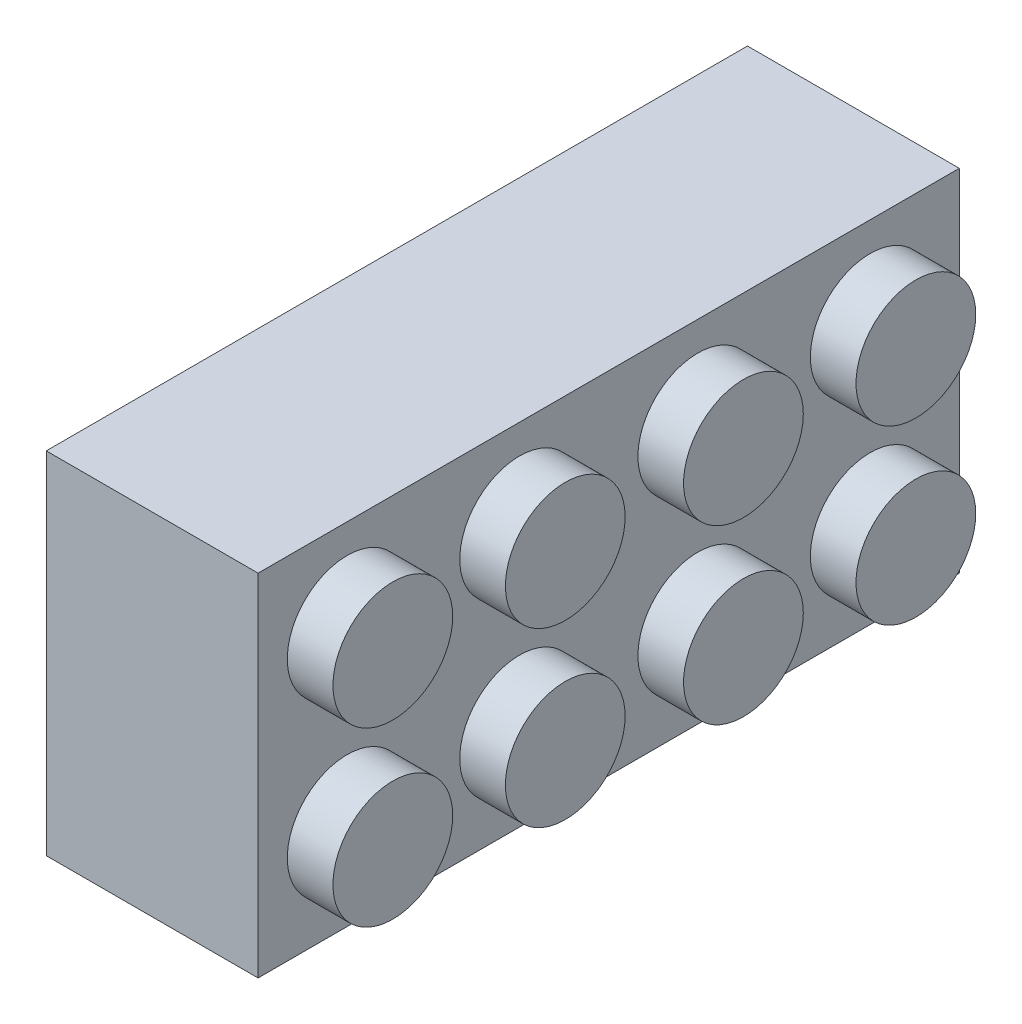
ISO-10303-21;
HEADER;
FILE_DESCRIPTION(('STEP AP214'),'2;1');
FILE_NAME('part.step','',(''),(''),'','','');
FILE_SCHEMA(('AUTOMOTIVE_DESIGN { 1 0 10303 214 1 1 1 1 }'));
ENDSEC;
DATA;
#1=APPLICATION_CONTEXT('core data for automotive mechanical design processes');
#2=APPLICATION_PROTOCOL_DEFINITION('international standard','automotive_design',2000,#1);
#3=PRODUCT_CONTEXT('',#1,'mechanical');
#4=PRODUCT('Part','Part','',(#3));
#5=PRODUCT_RELATED_PRODUCT_CATEGORY('part','',(#4));
#6=PRODUCT_DEFINITION_FORMATION('','',#4);
#7=PRODUCT_DEFINITION_CONTEXT('part definition',#1,'design');
#8=PRODUCT_DEFINITION('design','',#6,#7);
#9=PRODUCT_DEFINITION_SHAPE('','',#8);
#10=(LENGTH_UNIT() NAMED_UNIT(*) SI_UNIT(.MILLI.,.METRE.));
#11=(NAMED_UNIT(*) PLANE_ANGLE_UNIT() SI_UNIT($,.RADIAN.));
#12=(NAMED_UNIT(*) SI_UNIT($,.STERADIAN.) SOLID_ANGLE_UNIT());
#13=UNCERTAINTY_MEASURE_WITH_UNIT(LENGTH_MEASURE(1.E-05),#10,'distance_accuracy_value','');
#14=(GEOMETRIC_REPRESENTATION_CONTEXT(3) GLOBAL_UNCERTAINTY_ASSIGNED_CONTEXT((#13)) GLOBAL_UNIT_ASSIGNED_CONTEXT((#10,
#11,#12)) REPRESENTATION_CONTEXT('',''));
#15=CARTESIAN_POINT('',(0.,0.,0.));
#16=DIRECTION('',(0.,0.,1.));
#17=DIRECTION('',(1.,0.,0.));
#18=AXIS2_PLACEMENT_3D('',#15,#16,#17);
#19=CARTESIAN_POINT('',(0.,48.,48.));
#20=DIRECTION('',(1.,0.,0.));
#21=DIRECTION('',(0.,0.,-1.));
#22=AXIS2_PLACEMENT_3D('',#19,#20,#21);
#23=PLANE('',#22);
#24=DIRECTION('',(0.,0.,1.));
#25=VECTOR('',#24,1.);
#26=CARTESIAN_POINT('',(0.,96.,0.));
#27=LINE('',#26,#25);
#28=CARTESIAN_POINT('',(0.,96.,-96.));
#29=VERTEX_POINT('',#28);
#30=CARTESIAN_POINT('',(0.,96.,96.));
#31=VERTEX_POINT('',#30);
#32=EDGE_CURVE('E246',#29,#31,#27,.T.);
#33=ORIENTED_EDGE('',*,*,#32,.F.);
#34=DIRECTION('',(0.,1.,0.));
#35=VECTOR('',#34,1.);
#36=CARTESIAN_POINT('',(0.,0.,-96.));
#37=LINE('',#36,#35);
#38=CARTESIAN_POINT('',(0.,0.,-96.));
#39=VERTEX_POINT('',#38);
#40=EDGE_CURVE('E130',#39,#29,#37,.T.);
#41=ORIENTED_EDGE('',*,*,#40,.F.);
#42=DIRECTION('',(0.,0.,-1.));
#43=VECTOR('',#42,1.);
#44=CARTESIAN_POINT('',(0.,0.,96.));
#45=LINE('',#44,#43);
#46=CARTESIAN_POINT('',(0.,0.,96.));
#47=VERTEX_POINT('',#46);
#48=EDGE_CURVE('E251',#47,#39,#45,.T.);
#49=ORIENTED_EDGE('',*,*,#48,.F.);
#50=DIRECTION('',(0.,-1.,0.));
#51=VECTOR('',#50,1.);
#52=CARTESIAN_POINT('',(0.,96.,96.));
#53=LINE('',#52,#51);
#54=EDGE_CURVE('E67',#31,#47,#53,.T.);
#55=ORIENTED_EDGE('',*,*,#54,.F.);
#56=EDGE_LOOP('',(#33,#41,#49,#55));
#57=FACE_BOUND('',#56,.T.);
#58=DIRECTION('',(0.,0.,-1.));
#59=VECTOR('',#58,1.);
#60=CARTESIAN_POINT('',(0.,8.00000000000001,88.));
#61=LINE('',#60,#59);
#62=CARTESIAN_POINT('',(0.,8.00000000000001,88.));
#63=VERTEX_POINT('',#62);
#64=CARTESIAN_POINT('',(0.,8.,-88.));
#65=VERTEX_POINT('',#64);
#66=EDGE_CURVE('E225',#63,#65,#61,.T.);
#67=ORIENTED_EDGE('',*,*,#66,.T.);
#68=DIRECTION('',(0.,1.,0.));
#69=VECTOR('',#68,1.);
#70=CARTESIAN_POINT('',(0.,8.,-88.));
#71=LINE('',#70,#69);
#72=CARTESIAN_POINT('',(0.,88.,-88.));
#73=VERTEX_POINT('',#72);
#74=EDGE_CURVE('E141',#65,#73,#71,.T.);
#75=ORIENTED_EDGE('',*,*,#74,.T.);
#76=DIRECTION('',(0.,0.,1.));
#77=VECTOR('',#76,1.);
#78=CARTESIAN_POINT('',(0.,88.,8.));
#79=LINE('',#78,#77);
#80=CARTESIAN_POINT('',(0.,88.,88.));
#81=VERTEX_POINT('',#80);
#82=EDGE_CURVE('E217',#73,#81,#79,.T.);
#83=ORIENTED_EDGE('',*,*,#82,.T.);
#84=DIRECTION('',(0.,-1.,0.));
#85=VECTOR('',#84,1.);
#86=CARTESIAN_POINT('',(0.,88.,88.));
#87=LINE('',#86,#85);
#88=EDGE_CURVE('E235',#81,#63,#87,.T.);
#89=ORIENTED_EDGE('',*,*,#88,.T.);
#90=EDGE_LOOP('',(#67,#75,#83,#89));
#91=FACE_BOUND('',#90,.T.);
#92=ADVANCED_FACE('F43',(#57,#91),#23,.F.);
#93=CARTESIAN_POINT('',(48.,96.,0.));
#94=DIRECTION('',(0.,-1.,0.));
#95=DIRECTION('',(0.,0.,-1.));
#96=AXIS2_PLACEMENT_3D('',#93,#94,#95);
#97=PLANE('',#96);
#98=ORIENTED_EDGE('',*,*,#32,.T.);
#99=DIRECTION('',(-1.,0.,0.));
#100=VECTOR('',#99,1.);
#101=CARTESIAN_POINT('',(48.,96.,96.));
#102=LINE('',#101,#100);
#103=CARTESIAN_POINT('',(58.,96.,96.));
#104=VERTEX_POINT('',#103);
#105=EDGE_CURVE('E115',#104,#31,#102,.T.);
#106=ORIENTED_EDGE('',*,*,#105,.F.);
#107=DIRECTION('',(0.,0.,1.));
#108=VECTOR('',#107,1.);
#109=CARTESIAN_POINT('',(58.,96.,96.));
#110=LINE('',#109,#108);
#111=CARTESIAN_POINT('',(58.,96.,-96.));
#112=VERTEX_POINT('',#111);
#113=EDGE_CURVE('E110',#112,#104,#110,.T.);
#114=ORIENTED_EDGE('',*,*,#113,.F.);
#115=DIRECTION('',(-1.,0.,0.));
#116=VECTOR('',#115,1.);
#117=CARTESIAN_POINT('',(48.,96.,-96.));
#118=LINE('',#117,#116);
#119=EDGE_CURVE('E113',#112,#29,#118,.T.);
#120=ORIENTED_EDGE('',*,*,#119,.T.);
#121=EDGE_LOOP('',(#98,#106,#114,#120));
#122=FACE_BOUND('',#121,.T.);
#123=ADVANCED_FACE('F112',(#122),#97,.F.);
#124=CARTESIAN_POINT('',(48.,96.,96.));
#125=DIRECTION('',(0.,0.,-1.));
#126=DIRECTION('',(-1.,0.,0.));
#127=AXIS2_PLACEMENT_3D('',#124,#125,#126);
#128=PLANE('',#127);
#129=ORIENTED_EDGE('',*,*,#54,.T.);
#130=DIRECTION('',(-1.,0.,0.));
#131=VECTOR('',#130,1.);
#132=CARTESIAN_POINT('',(48.,0.,96.));
#133=LINE('',#132,#131);
#134=CARTESIAN_POINT('',(58.,0.,96.));
#135=VERTEX_POINT('',#134);
#136=EDGE_CURVE('E254',#135,#47,#133,.T.);
#137=ORIENTED_EDGE('',*,*,#136,.F.);
#138=DIRECTION('',(0.,-1.,0.));
#139=VECTOR('',#138,1.);
#140=CARTESIAN_POINT('',(58.,96.,96.));
#141=LINE('',#140,#139);
#142=EDGE_CURVE('E121',#104,#135,#141,.T.);
#143=ORIENTED_EDGE('',*,*,#142,.F.);
#144=ORIENTED_EDGE('',*,*,#105,.T.);
#145=EDGE_LOOP('',(#129,#137,#143,#144));
#146=FACE_BOUND('',#145,.T.);
#147=ADVANCED_FACE('F300',(#146),#128,.F.);
#148=CARTESIAN_POINT('',(48.,0.,96.));
#149=DIRECTION('',(0.,1.,0.));
#150=DIRECTION('',(0.,0.,1.));
#151=AXIS2_PLACEMENT_3D('',#148,#149,#150);
#152=PLANE('',#151);
#153=ORIENTED_EDGE('',*,*,#48,.T.);
#154=DIRECTION('',(-1.,0.,0.));
#155=VECTOR('',#154,1.);
#156=CARTESIAN_POINT('',(48.,0.,-96.));
#157=LINE('',#156,#155);
#158=CARTESIAN_POINT('',(58.,0.,-96.));
#159=VERTEX_POINT('',#158);
#160=EDGE_CURVE('E133',#159,#39,#157,.T.);
#161=ORIENTED_EDGE('',*,*,#160,.F.);
#162=DIRECTION('',(0.,0.,-1.));
#163=VECTOR('',#162,1.);
#164=CARTESIAN_POINT('',(58.,0.,96.));
#165=LINE('',#164,#163);
#166=EDGE_CURVE('E138',#135,#159,#165,.T.);
#167=ORIENTED_EDGE('',*,*,#166,.F.);
#168=ORIENTED_EDGE('',*,*,#136,.T.);
#169=EDGE_LOOP('',(#153,#161,#167,#168));
#170=FACE_BOUND('',#169,.T.);
#171=ADVANCED_FACE('F307',(#170),#152,.F.);
#172=CARTESIAN_POINT('',(48.,88.,8.));
#173=DIRECTION('',(0.,-1.,0.));
#174=DIRECTION('',(0.,0.,-1.));
#175=AXIS2_PLACEMENT_3D('',#172,#173,#174);
#176=PLANE('',#175);
#177=ORIENTED_EDGE('',*,*,#82,.F.);
#178=DIRECTION('',(-1.,0.,0.));
#179=VECTOR('',#178,1.);
#180=CARTESIAN_POINT('',(48.,88.,-88.));
#181=LINE('',#180,#179);
#182=CARTESIAN_POINT('',(48.,88.,-88.));
#183=VERTEX_POINT('',#182);
#184=EDGE_CURVE('E161',#183,#73,#181,.T.);
#185=ORIENTED_EDGE('',*,*,#184,.F.);
#186=DIRECTION('',(0.,0.,1.));
#187=VECTOR('',#186,1.);
#188=CARTESIAN_POINT('',(48.,88.,8.));
#189=LINE('',#188,#187);
#190=CARTESIAN_POINT('',(48.,88.,88.));
#191=VERTEX_POINT('',#190);
#192=EDGE_CURVE('E220',#183,#191,#189,.T.);
#193=ORIENTED_EDGE('',*,*,#192,.T.);
#194=DIRECTION('',(-1.,0.,0.));
#195=VECTOR('',#194,1.);
#196=CARTESIAN_POINT('',(48.,88.,88.));
#197=LINE('',#196,#195);
#198=EDGE_CURVE('E243',#191,#81,#197,.T.);
#199=ORIENTED_EDGE('',*,*,#198,.T.);
#200=EDGE_LOOP('',(#177,#185,#193,#199));
#201=FACE_BOUND('',#200,.T.);
#202=ADVANCED_FACE('F305',(#201),#176,.T.);
#203=CARTESIAN_POINT('',(48.,88.,88.));
#204=DIRECTION('',(0.,0.,-1.));
#205=DIRECTION('',(-1.,0.,0.));
#206=AXIS2_PLACEMENT_3D('',#203,#204,#205);
#207=PLANE('',#206);
#208=ORIENTED_EDGE('',*,*,#88,.F.);
#209=ORIENTED_EDGE('',*,*,#198,.F.);
#210=DIRECTION('',(0.,-1.,0.));
#211=VECTOR('',#210,1.);
#212=CARTESIAN_POINT('',(48.,88.,88.));
#213=LINE('',#212,#211);
#214=CARTESIAN_POINT('',(48.,8.00000000000001,88.));
#215=VERTEX_POINT('',#214);
#216=EDGE_CURVE('E224',#191,#215,#213,.T.);
#217=ORIENTED_EDGE('',*,*,#216,.T.);
#218=DIRECTION('',(-1.,0.,0.));
#219=VECTOR('',#218,1.);
#220=CARTESIAN_POINT('',(48.,8.00000000000001,88.));
#221=LINE('',#220,#219);
#222=EDGE_CURVE('E231',#215,#63,#221,.T.);
#223=ORIENTED_EDGE('',*,*,#222,.T.);
#224=EDGE_LOOP('',(#208,#209,#217,#223));
#225=FACE_BOUND('',#224,.T.);
#226=ADVANCED_FACE('F380',(#225),#207,.T.);
#227=CARTESIAN_POINT('',(48.,8.00000000000001,88.));
#228=DIRECTION('',(0.,1.,0.));
#229=DIRECTION('',(0.,0.,1.));
#230=AXIS2_PLACEMENT_3D('',#227,#228,#229);
#231=PLANE('',#230);
#232=ORIENTED_EDGE('',*,*,#66,.F.);
#233=ORIENTED_EDGE('',*,*,#222,.F.);
#234=DIRECTION('',(0.,0.,-1.));
#235=VECTOR('',#234,1.);
#236=CARTESIAN_POINT('',(48.,8.00000000000001,88.));
#237=LINE('',#236,#235);
#238=CARTESIAN_POINT('',(48.,8.,-88.));
#239=VERTEX_POINT('',#238);
#240=EDGE_CURVE('E59',#215,#239,#237,.T.);
#241=ORIENTED_EDGE('',*,*,#240,.T.);
#242=DIRECTION('',(-1.,0.,0.));
#243=VECTOR('',#242,1.);
#244=CARTESIAN_POINT('',(48.,8.,-88.));
#245=LINE('',#244,#243);
#246=EDGE_CURVE('E156',#239,#65,#245,.T.);
#247=ORIENTED_EDGE('',*,*,#246,.T.);
#248=EDGE_LOOP('',(#232,#233,#241,#247));
#249=FACE_BOUND('',#248,.T.);
#250=ADVANCED_FACE('F292',(#249),#231,.T.);
#251=CARTESIAN_POINT('',(48.,48.,48.));
#252=DIRECTION('',(1.,0.,0.));
#253=DIRECTION('',(0.,0.,-1.));
#254=AXIS2_PLACEMENT_3D('',#251,#252,#253);
#255=PLANE('',#254);
#256=CARTESIAN_POINT('',(48.,48.,0.));
#257=DIRECTION('',(1.,0.,0.));
#258=DIRECTION('',(0.,0.,-1.));
#259=AXIS2_PLACEMENT_3D('',#256,#257,#258);
#260=CIRCLE('',#259,22.6994558492443);
#261=CARTESIAN_POINT('',(48.,48.,-22.6994558492443));
#262=VERTEX_POINT('',#261);
#263=EDGE_CURVE('E12',#262,#262,#260,.T.);
#264=ORIENTED_EDGE('',*,*,#263,.T.);
#265=EDGE_LOOP('',(#264));
#266=FACE_BOUND('',#265,.T.);
#267=CARTESIAN_POINT('',(48.,48.,48.));
#268=DIRECTION('',(1.,0.,0.));
#269=DIRECTION('',(0.,0.,-1.));
#270=AXIS2_PLACEMENT_3D('',#267,#268,#269);
#271=CIRCLE('',#270,22.6994558492444);
#272=CARTESIAN_POINT('',(48.,48.,25.3005441507556));
#273=VERTEX_POINT('',#272);
#274=EDGE_CURVE('E263',#273,#273,#271,.T.);
#275=ORIENTED_EDGE('',*,*,#274,.T.);
#276=EDGE_LOOP('',(#275));
#277=FACE_BOUND('',#276,.T.);
#278=ORIENTED_EDGE('',*,*,#192,.F.);
#279=DIRECTION('',(0.,1.,0.));
#280=VECTOR('',#279,1.);
#281=CARTESIAN_POINT('',(48.,8.,-88.));
#282=LINE('',#281,#280);
#283=EDGE_CURVE('E147',#239,#183,#282,.T.);
#284=ORIENTED_EDGE('',*,*,#283,.F.);
#285=ORIENTED_EDGE('',*,*,#240,.F.);
#286=ORIENTED_EDGE('',*,*,#216,.F.);
#287=EDGE_LOOP('',(#278,#284,#285,#286));
#288=FACE_BOUND('',#287,.T.);
#289=CARTESIAN_POINT('',(48.,48.,-48.));
#290=DIRECTION('',(1.,0.,0.));
#291=DIRECTION('',(0.,0.,-1.));
#292=AXIS2_PLACEMENT_3D('',#289,#290,#291);
#293=CIRCLE('',#292,22.6994558492444);
#294=CARTESIAN_POINT('',(48.,48.,-70.6994558492444));
#295=VERTEX_POINT('',#294);
#296=EDGE_CURVE('E172',#295,#295,#293,.T.);
#297=ORIENTED_EDGE('',*,*,#296,.T.);
#298=EDGE_LOOP('',(#297));
#299=FACE_BOUND('',#298,.T.);
#300=ADVANCED_FACE('F277',(#266,#277,#288,#299),#255,.F.);
#301=CARTESIAN_POINT('',(58.,48.,48.));
#302=DIRECTION('',(1.,0.,0.));
#303=DIRECTION('',(0.,0.,-1.));
#304=AXIS2_PLACEMENT_3D('',#301,#302,#303);
#305=PLANE('',#304);
#306=CARTESIAN_POINT('',(58.,71.6080999106968,71.6080999106968));
#307=DIRECTION('',(1.,0.,0.));
#308=DIRECTION('',(0.,0.,-1.));
#309=AXIS2_PLACEMENT_3D('',#306,#307,#308);
#310=CIRCLE('',#309,16.3919000893032);
#311=CARTESIAN_POINT('',(58.,71.6080999106968,55.2161998213936));
#312=VERTEX_POINT('',#311);
#313=EDGE_CURVE('E181',#312,#312,#310,.T.);
#314=ORIENTED_EDGE('',*,*,#313,.F.);
#315=EDGE_LOOP('',(#314));
#316=FACE_BOUND('',#315,.T.);
#317=CARTESIAN_POINT('',(58.,24.3919000893032,71.6080999106968));
#318=DIRECTION('',(1.,0.,0.));
#319=DIRECTION('',(0.,0.,-1.));
#320=AXIS2_PLACEMENT_3D('',#317,#318,#319);
#321=CIRCLE('',#320,16.3919000893032);
#322=CARTESIAN_POINT('',(58.,24.3919000893032,55.2161998213936));
#323=VERTEX_POINT('',#322);
#324=EDGE_CURVE('E189',#323,#323,#321,.T.);
#325=ORIENTED_EDGE('',*,*,#324,.F.);
#326=EDGE_LOOP('',(#325));
#327=FACE_BOUND('',#326,.T.);
#328=CARTESIAN_POINT('',(58.,24.3919000893032,24.3919000893032));
#329=DIRECTION('',(1.,0.,0.));
#330=DIRECTION('',(0.,0.,-1.));
#331=AXIS2_PLACEMENT_3D('',#328,#329,#330);
#332=CIRCLE('',#331,16.3919000893032);
#333=CARTESIAN_POINT('',(58.,24.3919000893032,8.));
#334=VERTEX_POINT('',#333);
#335=EDGE_CURVE('E197',#334,#334,#332,.T.);
#336=ORIENTED_EDGE('',*,*,#335,.F.);
#337=EDGE_LOOP('',(#336));
#338=FACE_BOUND('',#337,.T.);
#339=CARTESIAN_POINT('',(58.,71.6080999106968,24.3919000893032));
#340=DIRECTION('',(1.,0.,0.));
#341=DIRECTION('',(0.,0.,-1.));
#342=AXIS2_PLACEMENT_3D('',#339,#340,#341);
#343=CIRCLE('',#342,16.3919000893032);
#344=CARTESIAN_POINT('',(58.,71.6080999106968,8.));
#345=VERTEX_POINT('',#344);
#346=EDGE_CURVE('E205',#345,#345,#343,.T.);
#347=ORIENTED_EDGE('',*,*,#346,.F.);
#348=EDGE_LOOP('',(#347));
#349=FACE_BOUND('',#348,.T.);
#350=ORIENTED_EDGE('',*,*,#113,.T.);
#351=ORIENTED_EDGE('',*,*,#142,.T.);
#352=ORIENTED_EDGE('',*,*,#166,.T.);
#353=DIRECTION('',(0.,1.,0.));
#354=VECTOR('',#353,1.);
#355=CARTESIAN_POINT('',(58.,96.,-96.));
#356=LINE('',#355,#354);
#357=EDGE_CURVE('E128',#159,#112,#356,.T.);
#358=ORIENTED_EDGE('',*,*,#357,.T.);
#359=EDGE_LOOP('',(#350,#351,#352,#358));
#360=FACE_BOUND('',#359,.T.);
#361=CARTESIAN_POINT('',(58.,71.6080999106968,-24.3919000893032));
#362=DIRECTION('',(1.,0.,0.));
#363=DIRECTION('',(0.,0.,-1.));
#364=AXIS2_PLACEMENT_3D('',#361,#362,#363);
#365=CIRCLE('',#364,16.3919000893032);
#366=CARTESIAN_POINT('',(58.,71.6080999106968,-40.7838001786064));
#367=VERTEX_POINT('',#366);
#368=EDGE_CURVE('E406',#367,#367,#365,.T.);
#369=ORIENTED_EDGE('',*,*,#368,.F.);
#370=EDGE_LOOP('',(#369));
#371=FACE_BOUND('',#370,.T.);
#372=CARTESIAN_POINT('',(58.,24.3919000893032,-24.3919000893032));
#373=DIRECTION('',(1.,0.,0.));
#374=DIRECTION('',(0.,0.,-1.));
#375=AXIS2_PLACEMENT_3D('',#372,#373,#374);
#376=CIRCLE('',#375,16.3919000893032);
#377=CARTESIAN_POINT('',(58.,24.3919000893032,-40.7838001786064));
#378=VERTEX_POINT('',#377);
#379=EDGE_CURVE('E423',#378,#378,#376,.T.);
#380=ORIENTED_EDGE('',*,*,#379,.F.);
#381=EDGE_LOOP('',(#380));
#382=FACE_BOUND('',#381,.T.);
#383=CARTESIAN_POINT('',(58.,24.3919000893032,-71.6080999106968));
#384=DIRECTION('',(1.,0.,0.));
#385=DIRECTION('',(0.,0.,-1.));
#386=AXIS2_PLACEMENT_3D('',#383,#384,#385);
#387=CIRCLE('',#386,16.3919000893032);
#388=CARTESIAN_POINT('',(58.,24.3919000893032,-88.));
#389=VERTEX_POINT('',#388);
#390=EDGE_CURVE('E429',#389,#389,#387,.T.);
#391=ORIENTED_EDGE('',*,*,#390,.F.);
#392=EDGE_LOOP('',(#391));
#393=FACE_BOUND('',#392,.T.);
#394=CARTESIAN_POINT('',(58.,71.6080999106968,-71.6080999106968));
#395=DIRECTION('',(1.,0.,0.));
#396=DIRECTION('',(0.,0.,-1.));
#397=AXIS2_PLACEMENT_3D('',#394,#395,#396);
#398=CIRCLE('',#397,16.3919000893032);
#399=CARTESIAN_POINT('',(58.,71.6080999106968,-88.));
#400=VERTEX_POINT('',#399);
#401=EDGE_CURVE('E150',#400,#400,#398,.T.);
#402=ORIENTED_EDGE('',*,*,#401,.F.);
#403=EDGE_LOOP('',(#402));
#404=FACE_BOUND('',#403,.T.);
#405=ADVANCED_FACE('F135',(#316,#327,#338,#349,#360,#371,#382,#393,#404),#305,.T.);
#406=CARTESIAN_POINT('',(70.5,71.6080999106968,24.3919000893032));
#407=DIRECTION('',(-1.,0.,0.));
#408=DIRECTION('',(0.,0.,1.));
#409=AXIS2_PLACEMENT_3D('',#406,#407,#408);
#410=CYLINDRICAL_SURFACE('',#409,16.3919000893032);
#411=CARTESIAN_POINT('',(70.5,71.6080999106968,24.3919000893032));
#412=DIRECTION('',(1.,0.,0.));
#413=DIRECTION('',(0.,0.,-1.));
#414=AXIS2_PLACEMENT_3D('',#411,#412,#413);
#415=CIRCLE('',#414,16.3919000893032);
#416=CARTESIAN_POINT('',(70.5,71.6080999106968,8.));
#417=VERTEX_POINT('',#416);
#418=EDGE_CURVE('E122',#417,#417,#415,.T.);
#419=ORIENTED_EDGE('',*,*,#418,.F.);
#420=EDGE_LOOP('',(#419));
#421=FACE_BOUND('',#420,.T.);
#422=ORIENTED_EDGE('',*,*,#346,.T.);
#423=EDGE_LOOP('',(#422));
#424=FACE_BOUND('',#423,.T.);
#425=ADVANCED_FACE('F362',(#421,#424),#410,.T.);
#426=CARTESIAN_POINT('',(70.5,71.6080999106968,24.3919000893032));
#427=DIRECTION('',(1.,0.,0.));
#428=DIRECTION('',(0.,0.,-1.));
#429=AXIS2_PLACEMENT_3D('',#426,#427,#428);
#430=PLANE('',#429);
#431=ORIENTED_EDGE('',*,*,#418,.T.);
#432=EDGE_LOOP('',(#431));
#433=FACE_BOUND('',#432,.T.);
#434=ADVANCED_FACE('F359',(#433),#430,.T.);
#435=CARTESIAN_POINT('',(70.5,24.3919000893032,24.3919000893032));
#436=DIRECTION('',(-1.,0.,0.));
#437=DIRECTION('',(0.,0.,1.));
#438=AXIS2_PLACEMENT_3D('',#435,#436,#437);
#439=CYLINDRICAL_SURFACE('',#438,16.3919000893032);
#440=CARTESIAN_POINT('',(70.5,24.3919000893032,24.3919000893032));
#441=DIRECTION('',(1.,0.,0.));
#442=DIRECTION('',(0.,0.,-1.));
#443=AXIS2_PLACEMENT_3D('',#440,#441,#442);
#444=CIRCLE('',#443,16.3919000893032);
#445=CARTESIAN_POINT('',(70.5,24.3919000893032,8.));
#446=VERTEX_POINT('',#445);
#447=EDGE_CURVE('E201',#446,#446,#444,.T.);
#448=ORIENTED_EDGE('',*,*,#447,.F.);
#449=EDGE_LOOP('',(#448));
#450=FACE_BOUND('',#449,.T.);
#451=ORIENTED_EDGE('',*,*,#335,.T.);
#452=EDGE_LOOP('',(#451));
#453=FACE_BOUND('',#452,.T.);
#454=ADVANCED_FACE('F355',(#450,#453),#439,.T.);
#455=CARTESIAN_POINT('',(70.5,24.3919000893032,24.3919000893032));
#456=DIRECTION('',(1.,0.,0.));
#457=DIRECTION('',(0.,0.,-1.));
#458=AXIS2_PLACEMENT_3D('',#455,#456,#457);
#459=PLANE('',#458);
#460=ORIENTED_EDGE('',*,*,#447,.T.);
#461=EDGE_LOOP('',(#460));
#462=FACE_BOUND('',#461,.T.);
#463=ADVANCED_FACE('F351',(#462),#459,.T.);
#464=CARTESIAN_POINT('',(70.5,24.3919000893032,71.6080999106968));
#465=DIRECTION('',(-1.,0.,0.));
#466=DIRECTION('',(0.,0.,1.));
#467=AXIS2_PLACEMENT_3D('',#464,#465,#466);
#468=CYLINDRICAL_SURFACE('',#467,16.3919000893032);
#469=CARTESIAN_POINT('',(70.5,24.3919000893032,71.6080999106968));
#470=DIRECTION('',(1.,0.,0.));
#471=DIRECTION('',(0.,0.,-1.));
#472=AXIS2_PLACEMENT_3D('',#469,#470,#471);
#473=CIRCLE('',#472,16.3919000893032);
#474=CARTESIAN_POINT('',(70.5,24.3919000893032,55.2161998213936));
#475=VERTEX_POINT('',#474);
#476=EDGE_CURVE('E193',#475,#475,#473,.T.);
#477=ORIENTED_EDGE('',*,*,#476,.F.);
#478=EDGE_LOOP('',(#477));
#479=FACE_BOUND('',#478,.T.);
#480=ORIENTED_EDGE('',*,*,#324,.T.);
#481=EDGE_LOOP('',(#480));
#482=FACE_BOUND('',#481,.T.);
#483=ADVANCED_FACE('F347',(#479,#482),#468,.T.);
#484=CARTESIAN_POINT('',(70.5,24.3919000893032,71.6080999106968));
#485=DIRECTION('',(1.,0.,0.));
#486=DIRECTION('',(0.,0.,-1.));
#487=AXIS2_PLACEMENT_3D('',#484,#485,#486);
#488=PLANE('',#487);
#489=ORIENTED_EDGE('',*,*,#476,.T.);
#490=EDGE_LOOP('',(#489));
#491=FACE_BOUND('',#490,.T.);
#492=ADVANCED_FACE('F343',(#491),#488,.T.);
#493=CARTESIAN_POINT('',(70.5,71.6080999106968,71.6080999106968));
#494=DIRECTION('',(-1.,0.,0.));
#495=DIRECTION('',(0.,0.,1.));
#496=AXIS2_PLACEMENT_3D('',#493,#494,#495);
#497=CYLINDRICAL_SURFACE('',#496,16.3919000893032);
#498=CARTESIAN_POINT('',(70.5,71.6080999106968,71.6080999106968));
#499=DIRECTION('',(1.,0.,0.));
#500=DIRECTION('',(0.,0.,-1.));
#501=AXIS2_PLACEMENT_3D('',#498,#499,#500);
#502=CIRCLE('',#501,16.3919000893032);
#503=CARTESIAN_POINT('',(70.5,71.6080999106968,55.2161998213936));
#504=VERTEX_POINT('',#503);
#505=EDGE_CURVE('E185',#504,#504,#502,.T.);
#506=ORIENTED_EDGE('',*,*,#505,.F.);
#507=EDGE_LOOP('',(#506));
#508=FACE_BOUND('',#507,.T.);
#509=ORIENTED_EDGE('',*,*,#313,.T.);
#510=EDGE_LOOP('',(#509));
#511=FACE_BOUND('',#510,.T.);
#512=ADVANCED_FACE('F339',(#508,#511),#497,.T.);
#513=CARTESIAN_POINT('',(70.5,71.6080999106968,71.6080999106968));
#514=DIRECTION('',(1.,0.,0.));
#515=DIRECTION('',(0.,0.,-1.));
#516=AXIS2_PLACEMENT_3D('',#513,#514,#515);
#517=PLANE('',#516);
#518=ORIENTED_EDGE('',*,*,#505,.T.);
#519=EDGE_LOOP('',(#518));
#520=FACE_BOUND('',#519,.T.);
#521=ADVANCED_FACE('F330',(#520),#517,.T.);
#522=CARTESIAN_POINT('',(100.325901807805,48.,48.));
#523=DIRECTION('',(-1.,0.,0.));
#524=DIRECTION('',(0.,0.,1.));
#525=AXIS2_PLACEMENT_3D('',#522,#523,#524);
#526=CYLINDRICAL_SURFACE('',#525,11.5);
#527=CARTESIAN_POINT('',(0.,48.,48.));
#528=DIRECTION('',(-1.,0.,0.));
#529=DIRECTION('',(0.,0.,1.));
#530=AXIS2_PLACEMENT_3D('',#527,#528,#529);
#531=CIRCLE('',#530,11.5);
#532=CARTESIAN_POINT('',(0.,48.,59.5));
#533=VERTEX_POINT('',#532);
#534=EDGE_CURVE('E176',#533,#533,#531,.T.);
#535=ORIENTED_EDGE('',*,*,#534,.T.);
#536=EDGE_LOOP('',(#535));
#537=FACE_BOUND('',#536,.T.);
#538=CARTESIAN_POINT('',(48.,48.,48.));
#539=DIRECTION('',(1.,0.,0.));
#540=DIRECTION('',(0.,0.,-1.));
#541=AXIS2_PLACEMENT_3D('',#538,#539,#540);
#542=CIRCLE('',#541,11.5);
#543=CARTESIAN_POINT('',(48.,48.,36.5));
#544=VERTEX_POINT('',#543);
#545=EDGE_CURVE('E259',#544,#544,#542,.T.);
#546=ORIENTED_EDGE('',*,*,#545,.T.);
#547=EDGE_LOOP('',(#546));
#548=FACE_BOUND('',#547,.T.);
#549=ADVANCED_FACE('F324',(#537,#548),#526,.F.);
#550=CARTESIAN_POINT('',(0.,48.,48.));
#551=DIRECTION('',(-1.,0.,0.));
#552=DIRECTION('',(0.,0.,1.));
#553=AXIS2_PLACEMENT_3D('',#550,#551,#552);
#554=PLANE('',#553);
#555=ORIENTED_EDGE('',*,*,#534,.F.);
#556=EDGE_LOOP('',(#555));
#557=FACE_BOUND('',#556,.T.);
#558=CARTESIAN_POINT('',(0.,48.,48.));
#559=DIRECTION('',(-1.,0.,0.));
#560=DIRECTION('',(0.,0.,1.));
#561=AXIS2_PLACEMENT_3D('',#558,#559,#560);
#562=CIRCLE('',#561,18.5);
#563=CARTESIAN_POINT('',(0.,48.,66.5));
#564=VERTEX_POINT('',#563);
#565=EDGE_CURVE('E177',#564,#564,#562,.T.);
#566=ORIENTED_EDGE('',*,*,#565,.T.);
#567=EDGE_LOOP('',(#566));
#568=FACE_BOUND('',#567,.T.);
#569=ADVANCED_FACE('F289',(#557,#568),#554,.T.);
#570=ORIENTED_EDGE('',*,*,#545,.F.);
#571=EDGE_LOOP('',(#570));
#572=FACE_BOUND('',#571,.T.);
#573=ADVANCED_FACE('F276',(#572),#255,.F.);
#574=CARTESIAN_POINT('',(1.77635683940025E-12,48.,48.));
#575=DIRECTION('',(1.,0.,0.));
#576=DIRECTION('',(0.,0.,-1.));
#577=AXIS2_PLACEMENT_3D('',#574,#575,#576);
#578=CONICAL_SURFACE('',#577,18.5,0.0872664625997202);
#579=ORIENTED_EDGE('',*,*,#274,.F.);
#580=EDGE_LOOP('',(#579));
#581=FACE_BOUND('',#580,.T.);
#582=ORIENTED_EDGE('',*,*,#565,.F.);
#583=EDGE_LOOP('',(#582));
#584=FACE_BOUND('',#583,.T.);
#585=ADVANCED_FACE('F288',(#581,#584),#578,.T.);
#586=CARTESIAN_POINT('',(48.,0.,-96.));
#587=DIRECTION('',(0.,0.,1.));
#588=DIRECTION('',(1.,0.,0.));
#589=AXIS2_PLACEMENT_3D('',#586,#587,#588);
#590=PLANE('',#589);
#591=ORIENTED_EDGE('',*,*,#40,.T.);
#592=ORIENTED_EDGE('',*,*,#119,.F.);
#593=ORIENTED_EDGE('',*,*,#357,.F.);
#594=ORIENTED_EDGE('',*,*,#160,.T.);
#595=EDGE_LOOP('',(#591,#592,#593,#594));
#596=FACE_BOUND('',#595,.T.);
#597=ADVANCED_FACE('F126',(#596),#590,.F.);
#598=CARTESIAN_POINT('',(48.,8.,-88.));
#599=DIRECTION('',(0.,0.,1.));
#600=DIRECTION('',(1.,0.,0.));
#601=AXIS2_PLACEMENT_3D('',#598,#599,#600);
#602=PLANE('',#601);
#603=ORIENTED_EDGE('',*,*,#74,.F.);
#604=ORIENTED_EDGE('',*,*,#246,.F.);
#605=ORIENTED_EDGE('',*,*,#283,.T.);
#606=ORIENTED_EDGE('',*,*,#184,.T.);
#607=EDGE_LOOP('',(#603,#604,#605,#606));
#608=FACE_BOUND('',#607,.T.);
#609=ADVANCED_FACE('F317',(#608),#602,.T.);
#610=CARTESIAN_POINT('',(70.5,71.6080999106968,-71.6080999106968));
#611=DIRECTION('',(-1.,0.,0.));
#612=DIRECTION('',(0.,0.,1.));
#613=AXIS2_PLACEMENT_3D('',#610,#611,#612);
#614=CYLINDRICAL_SURFACE('',#613,16.3919000893032);
#615=CARTESIAN_POINT('',(70.5,71.6080999106968,-71.6080999106968));
#616=DIRECTION('',(1.,0.,0.));
#617=DIRECTION('',(0.,0.,-1.));
#618=AXIS2_PLACEMENT_3D('',#615,#616,#617);
#619=CIRCLE('',#618,16.3919000893032);
#620=CARTESIAN_POINT('',(70.5,71.6080999106968,-88.));
#621=VERTEX_POINT('',#620);
#622=EDGE_CURVE('E142',#621,#621,#619,.T.);
#623=ORIENTED_EDGE('',*,*,#622,.F.);
#624=EDGE_LOOP('',(#623));
#625=FACE_BOUND('',#624,.T.);
#626=ORIENTED_EDGE('',*,*,#401,.T.);
#627=EDGE_LOOP('',(#626));
#628=FACE_BOUND('',#627,.T.);
#629=ADVANCED_FACE('F448',(#625,#628),#614,.T.);
#630=CARTESIAN_POINT('',(70.5,71.6080999106968,-71.6080999106968));
#631=DIRECTION('',(1.,0.,0.));
#632=DIRECTION('',(0.,0.,-1.));
#633=AXIS2_PLACEMENT_3D('',#630,#631,#632);
#634=PLANE('',#633);
#635=ORIENTED_EDGE('',*,*,#622,.T.);
#636=EDGE_LOOP('',(#635));
#637=FACE_BOUND('',#636,.T.);
#638=ADVANCED_FACE('F450',(#637),#634,.T.);
#639=CARTESIAN_POINT('',(70.5,24.3919000893032,-71.6080999106968));
#640=DIRECTION('',(-1.,0.,0.));
#641=DIRECTION('',(0.,0.,1.));
#642=AXIS2_PLACEMENT_3D('',#639,#640,#641);
#643=CYLINDRICAL_SURFACE('',#642,16.3919000893032);
#644=CARTESIAN_POINT('',(70.5,24.3919000893032,-71.6080999106968));
#645=DIRECTION('',(1.,0.,0.));
#646=DIRECTION('',(0.,0.,-1.));
#647=AXIS2_PLACEMENT_3D('',#644,#645,#646);
#648=CIRCLE('',#647,16.3919000893032);
#649=CARTESIAN_POINT('',(70.5,24.3919000893032,-88.));
#650=VERTEX_POINT('',#649);
#651=EDGE_CURVE('E433',#650,#650,#648,.T.);
#652=ORIENTED_EDGE('',*,*,#651,.F.);
#653=EDGE_LOOP('',(#652));
#654=FACE_BOUND('',#653,.T.);
#655=ORIENTED_EDGE('',*,*,#390,.T.);
#656=EDGE_LOOP('',(#655));
#657=FACE_BOUND('',#656,.T.);
#658=ADVANCED_FACE('F441',(#654,#657),#643,.T.);
#659=CARTESIAN_POINT('',(70.5,24.3919000893032,-71.6080999106968));
#660=DIRECTION('',(1.,0.,0.));
#661=DIRECTION('',(0.,0.,-1.));
#662=AXIS2_PLACEMENT_3D('',#659,#660,#661);
#663=PLANE('',#662);
#664=ORIENTED_EDGE('',*,*,#651,.T.);
#665=EDGE_LOOP('',(#664));
#666=FACE_BOUND('',#665,.T.);
#667=ADVANCED_FACE('F496',(#666),#663,.T.);
#668=CARTESIAN_POINT('',(70.5,24.3919000893032,-24.3919000893032));
#669=DIRECTION('',(-1.,0.,0.));
#670=DIRECTION('',(0.,0.,1.));
#671=AXIS2_PLACEMENT_3D('',#668,#669,#670);
#672=CYLINDRICAL_SURFACE('',#671,16.3919000893032);
#673=CARTESIAN_POINT('',(70.5,24.3919000893032,-24.3919000893032));
#674=DIRECTION('',(1.,0.,0.));
#675=DIRECTION('',(0.,0.,-1.));
#676=AXIS2_PLACEMENT_3D('',#673,#674,#675);
#677=CIRCLE('',#676,16.3919000893032);
#678=CARTESIAN_POINT('',(70.5,24.3919000893032,-40.7838001786064));
#679=VERTEX_POINT('',#678);
#680=EDGE_CURVE('E425',#679,#679,#677,.T.);
#681=ORIENTED_EDGE('',*,*,#680,.F.);
#682=EDGE_LOOP('',(#681));
#683=FACE_BOUND('',#682,.T.);
#684=ORIENTED_EDGE('',*,*,#379,.T.);
#685=EDGE_LOOP('',(#684));
#686=FACE_BOUND('',#685,.T.);
#687=ADVANCED_FACE('F492',(#683,#686),#672,.T.);
#688=CARTESIAN_POINT('',(70.5,24.3919000893032,-24.3919000893032));
#689=DIRECTION('',(1.,0.,0.));
#690=DIRECTION('',(0.,0.,-1.));
#691=AXIS2_PLACEMENT_3D('',#688,#689,#690);
#692=PLANE('',#691);
#693=ORIENTED_EDGE('',*,*,#680,.T.);
#694=EDGE_LOOP('',(#693));
#695=FACE_BOUND('',#694,.T.);
#696=ADVANCED_FACE('F488',(#695),#692,.T.);
#697=CARTESIAN_POINT('',(70.5,71.6080999106968,-24.3919000893032));
#698=DIRECTION('',(-1.,0.,0.));
#699=DIRECTION('',(0.,0.,1.));
#700=AXIS2_PLACEMENT_3D('',#697,#698,#699);
#701=CYLINDRICAL_SURFACE('',#700,16.3919000893032);
#702=CARTESIAN_POINT('',(70.5,71.6080999106968,-24.3919000893032));
#703=DIRECTION('',(1.,0.,0.));
#704=DIRECTION('',(0.,0.,-1.));
#705=AXIS2_PLACEMENT_3D('',#702,#703,#704);
#706=CIRCLE('',#705,16.3919000893032);
#707=CARTESIAN_POINT('',(70.5,71.6080999106968,-40.7838001786064));
#708=VERTEX_POINT('',#707);
#709=EDGE_CURVE('E412',#708,#708,#706,.T.);
#710=ORIENTED_EDGE('',*,*,#709,.F.);
#711=EDGE_LOOP('',(#710));
#712=FACE_BOUND('',#711,.T.);
#713=ORIENTED_EDGE('',*,*,#368,.T.);
#714=EDGE_LOOP('',(#713));
#715=FACE_BOUND('',#714,.T.);
#716=ADVANCED_FACE('F481',(#712,#715),#701,.T.);
#717=CARTESIAN_POINT('',(70.5,71.6080999106968,-24.3919000893032));
#718=DIRECTION('',(1.,0.,0.));
#719=DIRECTION('',(0.,0.,-1.));
#720=AXIS2_PLACEMENT_3D('',#717,#718,#719);
#721=PLANE('',#720);
#722=ORIENTED_EDGE('',*,*,#709,.T.);
#723=EDGE_LOOP('',(#722));
#724=FACE_BOUND('',#723,.T.);
#725=ADVANCED_FACE('F475',(#724),#721,.T.);
#726=CARTESIAN_POINT('',(100.325901807805,48.,-48.));
#727=DIRECTION('',(-1.,0.,0.));
#728=DIRECTION('',(0.,0.,1.));
#729=AXIS2_PLACEMENT_3D('',#726,#727,#728);
#730=CYLINDRICAL_SURFACE('',#729,11.5);
#731=CARTESIAN_POINT('',(0.,48.,-48.));
#732=DIRECTION('',(-1.,0.,0.));
#733=DIRECTION('',(0.,0.,1.));
#734=AXIS2_PLACEMENT_3D('',#731,#732,#733);
#735=CIRCLE('',#734,11.5);
#736=CARTESIAN_POINT('',(0.,48.,-36.5));
#737=VERTEX_POINT('',#736);
#738=EDGE_CURVE('E407',#737,#737,#735,.T.);
#739=ORIENTED_EDGE('',*,*,#738,.T.);
#740=EDGE_LOOP('',(#739));
#741=FACE_BOUND('',#740,.T.);
#742=CARTESIAN_POINT('',(48.,48.,-48.));
#743=DIRECTION('',(1.,0.,0.));
#744=DIRECTION('',(0.,0.,-1.));
#745=AXIS2_PLACEMENT_3D('',#742,#743,#744);
#746=CIRCLE('',#745,11.5);
#747=CARTESIAN_POINT('',(48.,48.,-59.5));
#748=VERTEX_POINT('',#747);
#749=EDGE_CURVE('E132',#748,#748,#746,.T.);
#750=ORIENTED_EDGE('',*,*,#749,.T.);
#751=EDGE_LOOP('',(#750));
#752=FACE_BOUND('',#751,.T.);
#753=ADVANCED_FACE('F469',(#741,#752),#730,.F.);
#754=CARTESIAN_POINT('',(0.,48.,-48.));
#755=DIRECTION('',(-1.,0.,0.));
#756=DIRECTION('',(0.,0.,1.));
#757=AXIS2_PLACEMENT_3D('',#754,#755,#756);
#758=PLANE('',#757);
#759=ORIENTED_EDGE('',*,*,#738,.F.);
#760=EDGE_LOOP('',(#759));
#761=FACE_BOUND('',#760,.T.);
#762=CARTESIAN_POINT('',(0.,48.,-48.));
#763=DIRECTION('',(-1.,0.,0.));
#764=DIRECTION('',(0.,0.,1.));
#765=AXIS2_PLACEMENT_3D('',#762,#763,#764);
#766=CIRCLE('',#765,18.5);
#767=CARTESIAN_POINT('',(0.,48.,-29.5));
#768=VERTEX_POINT('',#767);
#769=EDGE_CURVE('E403',#768,#768,#766,.T.);
#770=ORIENTED_EDGE('',*,*,#769,.T.);
#771=EDGE_LOOP('',(#770));
#772=FACE_BOUND('',#771,.T.);
#773=ADVANCED_FACE('F464',(#761,#772),#758,.T.);
#774=CARTESIAN_POINT('',(48.,48.,-48.));
#775=DIRECTION('',(1.,0.,0.));
#776=DIRECTION('',(0.,0.,-1.));
#777=AXIS2_PLACEMENT_3D('',#774,#775,#776);
#778=PLANE('',#777);
#779=ORIENTED_EDGE('',*,*,#749,.F.);
#780=EDGE_LOOP('',(#779));
#781=FACE_BOUND('',#780,.T.);
#782=ADVANCED_FACE('F400',(#781),#778,.F.);
#783=CARTESIAN_POINT('',(1.76247905159244E-12,48.,-48.));
#784=DIRECTION('',(1.,0.,0.));
#785=DIRECTION('',(0.,0.,-1.));
#786=AXIS2_PLACEMENT_3D('',#783,#784,#785);
#787=CONICAL_SURFACE('',#786,18.5,0.0872664625997202);
#788=ORIENTED_EDGE('',*,*,#296,.F.);
#789=EDGE_LOOP('',(#788));
#790=FACE_BOUND('',#789,.T.);
#791=ORIENTED_EDGE('',*,*,#769,.F.);
#792=EDGE_LOOP('',(#791));
#793=FACE_BOUND('',#792,.T.);
#794=ADVANCED_FACE('F335',(#790,#793),#787,.T.);
#795=CARTESIAN_POINT('',(100.325901807805,48.,0.));
#796=DIRECTION('',(-1.,0.,0.));
#797=DIRECTION('',(0.,0.,1.));
#798=AXIS2_PLACEMENT_3D('',#795,#796,#797);
#799=CYLINDRICAL_SURFACE('',#798,11.5);
#800=CARTESIAN_POINT('',(0.,48.,0.));
#801=DIRECTION('',(-1.,0.,0.));
#802=DIRECTION('',(0.,0.,1.));
#803=AXIS2_PLACEMENT_3D('',#800,#801,#802);
#804=CIRCLE('',#803,11.5);
#805=CARTESIAN_POINT('',(0.,48.,11.5));
#806=VERTEX_POINT('',#805);
#807=EDGE_CURVE('E418',#806,#806,#804,.T.);
#808=ORIENTED_EDGE('',*,*,#807,.T.);
#809=EDGE_LOOP('',(#808));
#810=FACE_BOUND('',#809,.T.);
#811=CARTESIAN_POINT('',(48.,48.,0.));
#812=DIRECTION('',(1.,0.,0.));
#813=DIRECTION('',(0.,0.,-1.));
#814=AXIS2_PLACEMENT_3D('',#811,#812,#813);
#815=CIRCLE('',#814,11.5);
#816=CARTESIAN_POINT('',(48.,48.,-11.5));
#817=VERTEX_POINT('',#816);
#818=EDGE_CURVE('E52',#817,#817,#815,.T.);
#819=ORIENTED_EDGE('',*,*,#818,.T.);
#820=EDGE_LOOP('',(#819));
#821=FACE_BOUND('',#820,.T.);
#822=ADVANCED_FACE('F270',(#810,#821),#799,.F.);
#823=CARTESIAN_POINT('',(0.,48.,0.));
#824=DIRECTION('',(-1.,0.,0.));
#825=DIRECTION('',(0.,0.,1.));
#826=AXIS2_PLACEMENT_3D('',#823,#824,#825);
#827=PLANE('',#826);
#828=ORIENTED_EDGE('',*,*,#807,.F.);
#829=EDGE_LOOP('',(#828));
#830=FACE_BOUND('',#829,.T.);
#831=CARTESIAN_POINT('',(0.,48.,0.));
#832=DIRECTION('',(-1.,0.,0.));
#833=DIRECTION('',(0.,0.,1.));
#834=AXIS2_PLACEMENT_3D('',#831,#832,#833);
#835=CIRCLE('',#834,18.5);
#836=CARTESIAN_POINT('',(0.,48.,18.5));
#837=VERTEX_POINT('',#836);
#838=EDGE_CURVE('E415',#837,#837,#835,.T.);
#839=ORIENTED_EDGE('',*,*,#838,.T.);
#840=EDGE_LOOP('',(#839));
#841=FACE_BOUND('',#840,.T.);
#842=ADVANCED_FACE('F274',(#830,#841),#827,.T.);
#843=ORIENTED_EDGE('',*,*,#818,.F.);
#844=EDGE_LOOP('',(#843));
#845=FACE_BOUND('',#844,.T.);
#846=ADVANCED_FACE('F272',(#845),#255,.F.);
#847=CARTESIAN_POINT('',(2.87270207621759E-12,48.,0.));
#848=DIRECTION('',(1.,0.,0.));
#849=DIRECTION('',(0.,0.,-1.));
#850=AXIS2_PLACEMENT_3D('',#847,#848,#849);
#851=CONICAL_SURFACE('',#850,18.5,0.0872664625997201);
#852=ORIENTED_EDGE('',*,*,#263,.F.);
#853=EDGE_LOOP('',(#852));
#854=FACE_BOUND('',#853,.T.);
#855=ORIENTED_EDGE('',*,*,#838,.F.);
#856=EDGE_LOOP('',(#855));
#857=FACE_BOUND('',#856,.T.);
#858=ADVANCED_FACE('F45',(#854,#857),#851,.T.);
#859=CLOSED_SHELL('',(#92,#123,#147,#171,#202,#226,#250,#300,#405,#425,#434,#454,#463,#483,#492,
#512,#521,#549,#569,#573,#585,#597,#609,#629,#638,#658,#667,#687,#696,#716,#725,#753,#773,#782,
#794,#822,#842,#846,#858));
#860=MANIFOLD_SOLID_BREP('B2',#859);
#861=ADVANCED_BREP_SHAPE_REPRESENTATION('',(#18,#860),#14);
#862=SHAPE_DEFINITION_REPRESENTATION(#9,#861);
ENDSEC;
END-ISO-10303-21;
